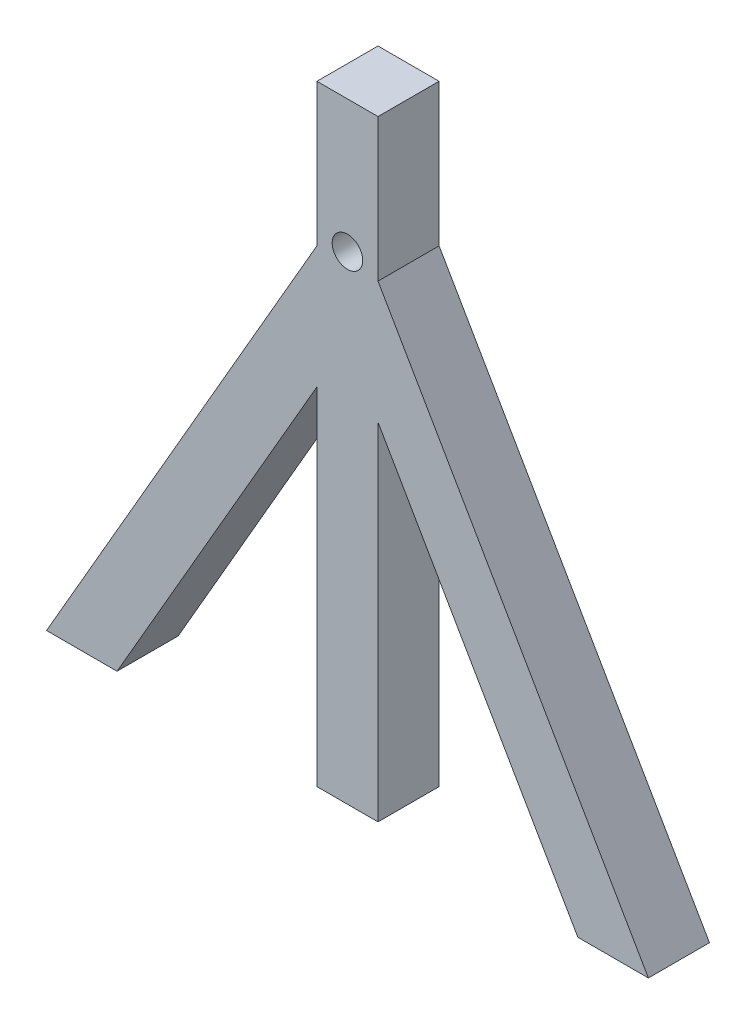
ISO-10303-21;
HEADER;
FILE_DESCRIPTION(('STEP AP214'),'2;1');
FILE_NAME('part.step','',(''),(''),'','','');
FILE_SCHEMA(('AUTOMOTIVE_DESIGN { 1 0 10303 214 1 1 1 1 }'));
ENDSEC;
DATA;
#1=APPLICATION_CONTEXT('core data for automotive mechanical design processes');
#2=APPLICATION_PROTOCOL_DEFINITION('international standard','automotive_design',2000,#1);
#3=PRODUCT_CONTEXT('',#1,'mechanical');
#4=PRODUCT('Part','Part','',(#3));
#5=PRODUCT_RELATED_PRODUCT_CATEGORY('part','',(#4));
#6=PRODUCT_DEFINITION_FORMATION('','',#4);
#7=PRODUCT_DEFINITION_CONTEXT('part definition',#1,'design');
#8=PRODUCT_DEFINITION('design','',#6,#7);
#9=PRODUCT_DEFINITION_SHAPE('','',#8);
#10=(LENGTH_UNIT() NAMED_UNIT(*) SI_UNIT(.MILLI.,.METRE.));
#11=(NAMED_UNIT(*) PLANE_ANGLE_UNIT() SI_UNIT($,.RADIAN.));
#12=(NAMED_UNIT(*) SI_UNIT($,.STERADIAN.) SOLID_ANGLE_UNIT());
#13=UNCERTAINTY_MEASURE_WITH_UNIT(LENGTH_MEASURE(1.E-05),#10,'distance_accuracy_value','');
#14=(GEOMETRIC_REPRESENTATION_CONTEXT(3) GLOBAL_UNCERTAINTY_ASSIGNED_CONTEXT((#13)) GLOBAL_UNIT_ASSIGNED_CONTEXT((#10,
#11,#12)) REPRESENTATION_CONTEXT('',''));
#15=CARTESIAN_POINT('',(0.,0.,0.));
#16=DIRECTION('',(0.,0.,1.));
#17=DIRECTION('',(1.,0.,0.));
#18=AXIS2_PLACEMENT_3D('',#15,#16,#17);
#19=CARTESIAN_POINT('',(14.9999999999999,80.0000000000009,30.));
#20=DIRECTION('',(-1.,0.,0.));
#21=DIRECTION('',(0.,-1.,0.));
#22=AXIS2_PLACEMENT_3D('',#19,#20,#21);
#23=PLANE('',#22);
#24=DIRECTION('',(0.,1.,0.));
#25=VECTOR('',#24,1.);
#26=CARTESIAN_POINT('',(14.9999999999999,80.0000000000009,0.));
#27=LINE('',#26,#25);
#28=CARTESIAN_POINT('',(14.9999999999999,80.0000000000009,0.));
#29=VERTEX_POINT('',#28);
#30=CARTESIAN_POINT('',(15.,150.,0.));
#31=VERTEX_POINT('',#30);
#32=EDGE_CURVE('E152',#29,#31,#27,.T.);
#33=ORIENTED_EDGE('',*,*,#32,.T.);
#34=DIRECTION('',(0.,0.,-1.));
#35=VECTOR('',#34,1.);
#36=CARTESIAN_POINT('',(15.,150.,30.));
#37=LINE('',#36,#35);
#38=CARTESIAN_POINT('',(15.,150.,30.));
#39=VERTEX_POINT('',#38);
#40=EDGE_CURVE('E11',#39,#31,#37,.T.);
#41=ORIENTED_EDGE('',*,*,#40,.F.);
#42=DIRECTION('',(0.,1.,0.));
#43=VECTOR('',#42,1.);
#44=CARTESIAN_POINT('',(14.9999999999999,80.0000000000009,30.));
#45=LINE('',#44,#43);
#46=CARTESIAN_POINT('',(14.9999999999999,80.0000000000009,30.));
#47=VERTEX_POINT('',#46);
#48=EDGE_CURVE('E175',#47,#39,#45,.T.);
#49=ORIENTED_EDGE('',*,*,#48,.F.);
#50=DIRECTION('',(0.,0.,-1.));
#51=VECTOR('',#50,1.);
#52=CARTESIAN_POINT('',(14.9999999999999,80.0000000000009,30.));
#53=LINE('',#52,#51);
#54=EDGE_CURVE('E148',#47,#29,#53,.T.);
#55=ORIENTED_EDGE('',*,*,#54,.T.);
#56=EDGE_LOOP('',(#33,#41,#49,#55));
#57=FACE_BOUND('',#56,.T.);
#58=ADVANCED_FACE('F32',(#57),#23,.F.);
#59=CARTESIAN_POINT('',(-15.,150.,30.));
#60=DIRECTION('',(0.,-1.,0.));
#61=DIRECTION('',(0.,0.,-1.));
#62=AXIS2_PLACEMENT_3D('',#59,#60,#61);
#63=PLANE('',#62);
#64=DIRECTION('',(-1.,0.,0.));
#65=VECTOR('',#64,1.);
#66=CARTESIAN_POINT('',(-15.,150.,0.));
#67=LINE('',#66,#65);
#68=CARTESIAN_POINT('',(-15.,150.,0.));
#69=VERTEX_POINT('',#68);
#70=EDGE_CURVE('E155',#31,#69,#67,.T.);
#71=ORIENTED_EDGE('',*,*,#70,.T.);
#72=DIRECTION('',(0.,0.,-1.));
#73=VECTOR('',#72,1.);
#74=CARTESIAN_POINT('',(-15.,150.,30.));
#75=LINE('',#74,#73);
#76=CARTESIAN_POINT('',(-15.,150.,30.));
#77=VERTEX_POINT('',#76);
#78=EDGE_CURVE('E40',#77,#69,#75,.T.);
#79=ORIENTED_EDGE('',*,*,#78,.F.);
#80=DIRECTION('',(-1.,0.,0.));
#81=VECTOR('',#80,1.);
#82=CARTESIAN_POINT('',(-15.,150.,30.));
#83=LINE('',#82,#81);
#84=EDGE_CURVE('E103',#39,#77,#83,.T.);
#85=ORIENTED_EDGE('',*,*,#84,.F.);
#86=ORIENTED_EDGE('',*,*,#40,.T.);
#87=EDGE_LOOP('',(#71,#79,#85,#86));
#88=FACE_BOUND('',#87,.T.);
#89=ADVANCED_FACE('F254',(#88),#63,.F.);
#90=CARTESIAN_POINT('',(-15.,80.0000000000009,30.));
#91=DIRECTION('',(1.,0.,0.));
#92=DIRECTION('',(0.,1.,0.));
#93=AXIS2_PLACEMENT_3D('',#90,#91,#92);
#94=PLANE('',#93);
#95=DIRECTION('',(0.,-1.,0.));
#96=VECTOR('',#95,1.);
#97=CARTESIAN_POINT('',(-15.,80.0000000000009,0.));
#98=LINE('',#97,#96);
#99=CARTESIAN_POINT('',(-15.,80.0000000000009,0.));
#100=VERTEX_POINT('',#99);
#101=EDGE_CURVE('E158',#69,#100,#98,.T.);
#102=ORIENTED_EDGE('',*,*,#101,.T.);
#103=DIRECTION('',(0.,0.,-1.));
#104=VECTOR('',#103,1.);
#105=CARTESIAN_POINT('',(-15.,80.0000000000009,30.));
#106=LINE('',#105,#104);
#107=CARTESIAN_POINT('',(-15.,80.0000000000009,30.));
#108=VERTEX_POINT('',#107);
#109=EDGE_CURVE('E194',#108,#100,#106,.T.);
#110=ORIENTED_EDGE('',*,*,#109,.F.);
#111=DIRECTION('',(0.,-1.,0.));
#112=VECTOR('',#111,1.);
#113=CARTESIAN_POINT('',(-15.,80.0000000000009,30.));
#114=LINE('',#113,#112);
#115=EDGE_CURVE('E202',#77,#108,#114,.T.);
#116=ORIENTED_EDGE('',*,*,#115,.F.);
#117=ORIENTED_EDGE('',*,*,#78,.T.);
#118=EDGE_LOOP('',(#102,#110,#116,#117));
#119=FACE_BOUND('',#118,.T.);
#120=ADVANCED_FACE('F200',(#119),#94,.F.);
#121=CARTESIAN_POINT('',(-147.790561913612,-150.,30.));
#122=DIRECTION('',(0.866025403784442,-0.499999999999995,0.));
#123=DIRECTION('',(0.499999999999995,0.866025403784442,0.));
#124=AXIS2_PLACEMENT_3D('',#121,#122,#123);
#125=PLANE('',#124);
#126=DIRECTION('',(-0.499999999999995,-0.866025403784442,0.));
#127=VECTOR('',#126,1.);
#128=CARTESIAN_POINT('',(-147.790561913612,-150.,0.));
#129=LINE('',#128,#127);
#130=CARTESIAN_POINT('',(-147.790561913612,-150.,0.));
#131=VERTEX_POINT('',#130);
#132=EDGE_CURVE('E160',#100,#131,#129,.T.);
#133=ORIENTED_EDGE('',*,*,#132,.T.);
#134=DIRECTION('',(0.,0.,-1.));
#135=VECTOR('',#134,1.);
#136=CARTESIAN_POINT('',(-147.790561913612,-150.,30.));
#137=LINE('',#136,#135);
#138=CARTESIAN_POINT('',(-147.790561913612,-150.,30.));
#139=VERTEX_POINT('',#138);
#140=EDGE_CURVE('E191',#139,#131,#137,.T.);
#141=ORIENTED_EDGE('',*,*,#140,.F.);
#142=DIRECTION('',(-0.499999999999995,-0.866025403784442,0.));
#143=VECTOR('',#142,1.);
#144=CARTESIAN_POINT('',(-147.790561913612,-150.,30.));
#145=LINE('',#144,#143);
#146=EDGE_CURVE('E220',#108,#139,#145,.T.);
#147=ORIENTED_EDGE('',*,*,#146,.F.);
#148=ORIENTED_EDGE('',*,*,#109,.T.);
#149=EDGE_LOOP('',(#133,#141,#147,#148));
#150=FACE_BOUND('',#149,.T.);
#151=ADVANCED_FACE('F211',(#150),#125,.F.);
#152=CARTESIAN_POINT('',(-113.149545762235,-150.,30.));
#153=DIRECTION('',(0.,1.,0.));
#154=DIRECTION('',(0.,0.,1.));
#155=AXIS2_PLACEMENT_3D('',#152,#153,#154);
#156=PLANE('',#155);
#157=DIRECTION('',(1.,0.,0.));
#158=VECTOR('',#157,1.);
#159=CARTESIAN_POINT('',(-113.149545762235,-150.,0.));
#160=LINE('',#159,#158);
#161=CARTESIAN_POINT('',(-113.149545762235,-150.,0.));
#162=VERTEX_POINT('',#161);
#163=EDGE_CURVE('E162',#131,#162,#160,.T.);
#164=ORIENTED_EDGE('',*,*,#163,.T.);
#165=DIRECTION('',(0.,0.,-1.));
#166=VECTOR('',#165,1.);
#167=CARTESIAN_POINT('',(-113.149545762235,-150.,30.));
#168=LINE('',#167,#166);
#169=CARTESIAN_POINT('',(-113.149545762235,-150.,30.));
#170=VERTEX_POINT('',#169);
#171=EDGE_CURVE('E188',#170,#162,#168,.T.);
#172=ORIENTED_EDGE('',*,*,#171,.F.);
#173=DIRECTION('',(1.,0.,0.));
#174=VECTOR('',#173,1.);
#175=CARTESIAN_POINT('',(-113.149545762235,-150.,30.));
#176=LINE('',#175,#174);
#177=EDGE_CURVE('E217',#139,#170,#176,.T.);
#178=ORIENTED_EDGE('',*,*,#177,.F.);
#179=ORIENTED_EDGE('',*,*,#140,.T.);
#180=EDGE_LOOP('',(#164,#172,#178,#179));
#181=FACE_BOUND('',#180,.T.);
#182=ADVANCED_FACE('F215',(#181),#156,.F.);
#183=CARTESIAN_POINT('',(-15.,20.0000000000002,30.));
#184=DIRECTION('',(-0.866025403784442,0.499999999999995,0.));
#185=DIRECTION('',(-0.499999999999995,-0.866025403784442,0.));
#186=AXIS2_PLACEMENT_3D('',#183,#184,#185);
#187=PLANE('',#186);
#188=DIRECTION('',(0.499999999999995,0.866025403784442,0.));
#189=VECTOR('',#188,1.);
#190=CARTESIAN_POINT('',(-15.,20.0000000000002,0.));
#191=LINE('',#190,#189);
#192=CARTESIAN_POINT('',(-15.,20.0000000000002,0.));
#193=VERTEX_POINT('',#192);
#194=EDGE_CURVE('E164',#162,#193,#191,.T.);
#195=ORIENTED_EDGE('',*,*,#194,.T.);
#196=DIRECTION('',(0.,0.,-1.));
#197=VECTOR('',#196,1.);
#198=CARTESIAN_POINT('',(-15.,20.0000000000002,30.));
#199=LINE('',#198,#197);
#200=CARTESIAN_POINT('',(-15.,20.0000000000002,30.));
#201=VERTEX_POINT('',#200);
#202=EDGE_CURVE('E185',#201,#193,#199,.T.);
#203=ORIENTED_EDGE('',*,*,#202,.F.);
#204=DIRECTION('',(0.499999999999995,0.866025403784442,0.));
#205=VECTOR('',#204,1.);
#206=CARTESIAN_POINT('',(-15.,20.0000000000002,30.));
#207=LINE('',#206,#205);
#208=EDGE_CURVE('E219',#170,#201,#207,.T.);
#209=ORIENTED_EDGE('',*,*,#208,.F.);
#210=ORIENTED_EDGE('',*,*,#171,.T.);
#211=EDGE_LOOP('',(#195,#203,#209,#210));
#212=FACE_BOUND('',#211,.T.);
#213=ADVANCED_FACE('F267',(#212),#187,.F.);
#214=CARTESIAN_POINT('',(-15.,-150.,30.));
#215=DIRECTION('',(1.,0.,0.));
#216=DIRECTION('',(0.,1.,0.));
#217=AXIS2_PLACEMENT_3D('',#214,#215,#216);
#218=PLANE('',#217);
#219=DIRECTION('',(0.,-1.,0.));
#220=VECTOR('',#219,1.);
#221=CARTESIAN_POINT('',(-15.,-150.,0.));
#222=LINE('',#221,#220);
#223=CARTESIAN_POINT('',(-15.,-150.,0.));
#224=VERTEX_POINT('',#223);
#225=EDGE_CURVE('E166',#193,#224,#222,.T.);
#226=ORIENTED_EDGE('',*,*,#225,.T.);
#227=DIRECTION('',(0.,0.,-1.));
#228=VECTOR('',#227,1.);
#229=CARTESIAN_POINT('',(-15.,-150.,30.));
#230=LINE('',#229,#228);
#231=CARTESIAN_POINT('',(-15.,-150.,30.));
#232=VERTEX_POINT('',#231);
#233=EDGE_CURVE('E182',#232,#224,#230,.T.);
#234=ORIENTED_EDGE('',*,*,#233,.F.);
#235=DIRECTION('',(0.,-1.,0.));
#236=VECTOR('',#235,1.);
#237=CARTESIAN_POINT('',(-15.,-150.,30.));
#238=LINE('',#237,#236);
#239=EDGE_CURVE('E222',#201,#232,#238,.T.);
#240=ORIENTED_EDGE('',*,*,#239,.F.);
#241=ORIENTED_EDGE('',*,*,#202,.T.);
#242=EDGE_LOOP('',(#226,#234,#240,#241));
#243=FACE_BOUND('',#242,.T.);
#244=ADVANCED_FACE('F270',(#243),#218,.F.);
#245=CARTESIAN_POINT('',(-15.,-150.,30.));
#246=DIRECTION('',(0.,1.,0.));
#247=DIRECTION('',(0.,0.,1.));
#248=AXIS2_PLACEMENT_3D('',#245,#246,#247);
#249=PLANE('',#248);
#250=DIRECTION('',(1.,0.,0.));
#251=VECTOR('',#250,1.);
#252=CARTESIAN_POINT('',(-15.,-150.,0.));
#253=LINE('',#252,#251);
#254=CARTESIAN_POINT('',(15.,-150.,0.));
#255=VERTEX_POINT('',#254);
#256=EDGE_CURVE('E168',#224,#255,#253,.T.);
#257=ORIENTED_EDGE('',*,*,#256,.T.);
#258=DIRECTION('',(0.,0.,-1.));
#259=VECTOR('',#258,1.);
#260=CARTESIAN_POINT('',(15.,-150.,30.));
#261=LINE('',#260,#259);
#262=CARTESIAN_POINT('',(15.,-150.,30.));
#263=VERTEX_POINT('',#262);
#264=EDGE_CURVE('E179',#263,#255,#261,.T.);
#265=ORIENTED_EDGE('',*,*,#264,.F.);
#266=DIRECTION('',(1.,0.,0.));
#267=VECTOR('',#266,1.);
#268=CARTESIAN_POINT('',(-15.,-150.,30.));
#269=LINE('',#268,#267);
#270=EDGE_CURVE('E228',#232,#263,#269,.T.);
#271=ORIENTED_EDGE('',*,*,#270,.F.);
#272=ORIENTED_EDGE('',*,*,#233,.T.);
#273=EDGE_LOOP('',(#257,#265,#271,#272));
#274=FACE_BOUND('',#273,.T.);
#275=ADVANCED_FACE('F234',(#274),#249,.F.);
#276=CARTESIAN_POINT('',(15.,-150.,30.));
#277=DIRECTION('',(-1.,0.,0.));
#278=DIRECTION('',(0.,-1.,0.));
#279=AXIS2_PLACEMENT_3D('',#276,#277,#278);
#280=PLANE('',#279);
#281=DIRECTION('',(0.,1.,0.));
#282=VECTOR('',#281,1.);
#283=CARTESIAN_POINT('',(15.,-150.,0.));
#284=LINE('',#283,#282);
#285=CARTESIAN_POINT('',(15.,20.0000000000002,0.));
#286=VERTEX_POINT('',#285);
#287=EDGE_CURVE('E170',#255,#286,#284,.T.);
#288=ORIENTED_EDGE('',*,*,#287,.T.);
#289=DIRECTION('',(0.,0.,-1.));
#290=VECTOR('',#289,1.);
#291=CARTESIAN_POINT('',(15.,20.0000000000002,30.));
#292=LINE('',#291,#290);
#293=CARTESIAN_POINT('',(15.,20.0000000000002,30.));
#294=VERTEX_POINT('',#293);
#295=EDGE_CURVE('E143',#294,#286,#292,.T.);
#296=ORIENTED_EDGE('',*,*,#295,.F.);
#297=DIRECTION('',(0.,1.,0.));
#298=VECTOR('',#297,1.);
#299=CARTESIAN_POINT('',(15.,-150.,30.));
#300=LINE('',#299,#298);
#301=EDGE_CURVE('E134',#263,#294,#300,.T.);
#302=ORIENTED_EDGE('',*,*,#301,.F.);
#303=ORIENTED_EDGE('',*,*,#264,.T.);
#304=EDGE_LOOP('',(#288,#296,#302,#303));
#305=FACE_BOUND('',#304,.T.);
#306=ADVANCED_FACE('F238',(#305),#280,.F.);
#307=CARTESIAN_POINT('',(15.,20.0000000000002,30.));
#308=DIRECTION('',(0.866025403784442,0.499999999999995,0.));
#309=DIRECTION('',(-0.499999999999995,0.866025403784442,0.));
#310=AXIS2_PLACEMENT_3D('',#307,#308,#309);
#311=PLANE('',#310);
#312=DIRECTION('',(0.499999999999995,-0.866025403784442,0.));
#313=VECTOR('',#312,1.);
#314=CARTESIAN_POINT('',(15.,20.0000000000002,0.));
#315=LINE('',#314,#313);
#316=CARTESIAN_POINT('',(113.149545762235,-150.,0.));
#317=VERTEX_POINT('',#316);
#318=EDGE_CURVE('E142',#286,#317,#315,.T.);
#319=ORIENTED_EDGE('',*,*,#318,.T.);
#320=DIRECTION('',(0.,0.,-1.));
#321=VECTOR('',#320,1.);
#322=CARTESIAN_POINT('',(113.149545762235,-150.,30.));
#323=LINE('',#322,#321);
#324=CARTESIAN_POINT('',(113.149545762235,-150.,30.));
#325=VERTEX_POINT('',#324);
#326=EDGE_CURVE('E139',#325,#317,#323,.T.);
#327=ORIENTED_EDGE('',*,*,#326,.F.);
#328=DIRECTION('',(0.499999999999995,-0.866025403784442,0.));
#329=VECTOR('',#328,1.);
#330=CARTESIAN_POINT('',(15.,20.0000000000002,30.));
#331=LINE('',#330,#329);
#332=EDGE_CURVE('E128',#294,#325,#331,.T.);
#333=ORIENTED_EDGE('',*,*,#332,.F.);
#334=ORIENTED_EDGE('',*,*,#295,.T.);
#335=EDGE_LOOP('',(#319,#327,#333,#334));
#336=FACE_BOUND('',#335,.T.);
#337=ADVANCED_FACE('F140',(#336),#311,.F.);
#338=CARTESIAN_POINT('',(113.149545762235,-150.,30.));
#339=DIRECTION('',(0.,1.,0.));
#340=DIRECTION('',(0.,0.,1.));
#341=AXIS2_PLACEMENT_3D('',#338,#339,#340);
#342=PLANE('',#341);
#343=DIRECTION('',(1.,0.,0.));
#344=VECTOR('',#343,1.);
#345=CARTESIAN_POINT('',(113.149545762235,-150.,0.));
#346=LINE('',#345,#344);
#347=CARTESIAN_POINT('',(147.790561913612,-150.,0.));
#348=VERTEX_POINT('',#347);
#349=EDGE_CURVE('E89',#317,#348,#346,.T.);
#350=ORIENTED_EDGE('',*,*,#349,.T.);
#351=DIRECTION('',(0.,0.,-1.));
#352=VECTOR('',#351,1.);
#353=CARTESIAN_POINT('',(147.790561913612,-150.,30.));
#354=LINE('',#353,#352);
#355=CARTESIAN_POINT('',(147.790561913612,-150.,30.));
#356=VERTEX_POINT('',#355);
#357=EDGE_CURVE('E144',#356,#348,#354,.T.);
#358=ORIENTED_EDGE('',*,*,#357,.F.);
#359=DIRECTION('',(1.,0.,0.));
#360=VECTOR('',#359,1.);
#361=CARTESIAN_POINT('',(113.149545762235,-150.,30.));
#362=LINE('',#361,#360);
#363=EDGE_CURVE('E132',#325,#356,#362,.T.);
#364=ORIENTED_EDGE('',*,*,#363,.F.);
#365=ORIENTED_EDGE('',*,*,#326,.T.);
#366=EDGE_LOOP('',(#350,#358,#364,#365));
#367=FACE_BOUND('',#366,.T.);
#368=ADVANCED_FACE('F146',(#367),#342,.F.);
#369=CARTESIAN_POINT('',(147.790561913612,-150.,30.));
#370=DIRECTION('',(-0.866025403784441,-0.499999999999995,0.));
#371=DIRECTION('',(0.499999999999995,-0.866025403784442,0.));
#372=AXIS2_PLACEMENT_3D('',#369,#370,#371);
#373=PLANE('',#372);
#374=DIRECTION('',(-0.499999999999995,0.866025403784442,0.));
#375=VECTOR('',#374,1.);
#376=CARTESIAN_POINT('',(147.790561913612,-150.,0.));
#377=LINE('',#376,#375);
#378=EDGE_CURVE('E95',#348,#29,#377,.T.);
#379=ORIENTED_EDGE('',*,*,#378,.T.);
#380=ORIENTED_EDGE('',*,*,#54,.F.);
#381=DIRECTION('',(-0.499999999999995,0.866025403784442,0.));
#382=VECTOR('',#381,1.);
#383=CARTESIAN_POINT('',(147.790561913612,-150.,30.));
#384=LINE('',#383,#382);
#385=EDGE_CURVE('E48',#356,#47,#384,.T.);
#386=ORIENTED_EDGE('',*,*,#385,.F.);
#387=ORIENTED_EDGE('',*,*,#357,.T.);
#388=EDGE_LOOP('',(#379,#380,#386,#387));
#389=FACE_BOUND('',#388,.T.);
#390=ADVANCED_FACE('F242',(#389),#373,.F.);
#391=CARTESIAN_POINT('',(0.,0.,30.));
#392=DIRECTION('',(0.,0.,-1.));
#393=DIRECTION('',(-1.,0.,0.));
#394=AXIS2_PLACEMENT_3D('',#391,#392,#393);
#395=PLANE('',#394);
#396=CARTESIAN_POINT('',(0.,85.0000000000001,30.));
#397=DIRECTION('',(0.,0.,1.));
#398=DIRECTION('',(1.,0.,0.));
#399=AXIS2_PLACEMENT_3D('',#396,#397,#398);
#400=CIRCLE('',#399,7.5);
#401=CARTESIAN_POINT('',(7.5,85.0000000000001,30.));
#402=VERTEX_POINT('',#401);
#403=EDGE_CURVE('E325',#402,#402,#400,.T.);
#404=ORIENTED_EDGE('',*,*,#403,.F.);
#405=EDGE_LOOP('',(#404));
#406=FACE_BOUND('',#405,.T.);
#407=ORIENTED_EDGE('',*,*,#48,.T.);
#408=ORIENTED_EDGE('',*,*,#84,.T.);
#409=ORIENTED_EDGE('',*,*,#115,.T.);
#410=ORIENTED_EDGE('',*,*,#146,.T.);
#411=ORIENTED_EDGE('',*,*,#177,.T.);
#412=ORIENTED_EDGE('',*,*,#208,.T.);
#413=ORIENTED_EDGE('',*,*,#239,.T.);
#414=ORIENTED_EDGE('',*,*,#270,.T.);
#415=ORIENTED_EDGE('',*,*,#301,.T.);
#416=ORIENTED_EDGE('',*,*,#332,.T.);
#417=ORIENTED_EDGE('',*,*,#363,.T.);
#418=ORIENTED_EDGE('',*,*,#385,.T.);
#419=EDGE_LOOP('',(#407,#408,#409,#410,#411,#412,#413,#414,#415,#416,#417,#418));
#420=FACE_BOUND('',#419,.T.);
#421=ADVANCED_FACE('F130',(#406,#420),#395,.F.);
#422=CARTESIAN_POINT('',(0.,0.,0.));
#423=DIRECTION('',(0.,0.,-1.));
#424=DIRECTION('',(-1.,0.,0.));
#425=AXIS2_PLACEMENT_3D('',#422,#423,#424);
#426=PLANE('',#425);
#427=CARTESIAN_POINT('',(0.,85.0000000000001,0.));
#428=DIRECTION('',(0.,0.,1.));
#429=DIRECTION('',(1.,0.,0.));
#430=AXIS2_PLACEMENT_3D('',#427,#428,#429);
#431=CIRCLE('',#430,7.5);
#432=CARTESIAN_POINT('',(7.5,85.0000000000001,0.));
#433=VERTEX_POINT('',#432);
#434=EDGE_CURVE('E156',#433,#433,#431,.T.);
#435=ORIENTED_EDGE('',*,*,#434,.T.);
#436=EDGE_LOOP('',(#435));
#437=FACE_BOUND('',#436,.T.);
#438=ORIENTED_EDGE('',*,*,#32,.F.);
#439=ORIENTED_EDGE('',*,*,#378,.F.);
#440=ORIENTED_EDGE('',*,*,#349,.F.);
#441=ORIENTED_EDGE('',*,*,#318,.F.);
#442=ORIENTED_EDGE('',*,*,#287,.F.);
#443=ORIENTED_EDGE('',*,*,#256,.F.);
#444=ORIENTED_EDGE('',*,*,#225,.F.);
#445=ORIENTED_EDGE('',*,*,#194,.F.);
#446=ORIENTED_EDGE('',*,*,#163,.F.);
#447=ORIENTED_EDGE('',*,*,#132,.F.);
#448=ORIENTED_EDGE('',*,*,#101,.F.);
#449=ORIENTED_EDGE('',*,*,#70,.F.);
#450=EDGE_LOOP('',(#438,#439,#440,#441,#442,#443,#444,#445,#446,#447,#448,#449));
#451=FACE_BOUND('',#450,.T.);
#452=ADVANCED_FACE('F206',(#437,#451),#426,.T.);
#453=CARTESIAN_POINT('',(0.,85.0000000000001,0.));
#454=DIRECTION('',(0.,0.,1.));
#455=DIRECTION('',(1.,0.,0.));
#456=AXIS2_PLACEMENT_3D('',#453,#454,#455);
#457=CYLINDRICAL_SURFACE('',#456,7.5);
#458=ORIENTED_EDGE('',*,*,#434,.F.);
#459=EDGE_LOOP('',(#458));
#460=FACE_BOUND('',#459,.T.);
#461=ORIENTED_EDGE('',*,*,#403,.T.);
#462=EDGE_LOOP('',(#461));
#463=FACE_BOUND('',#462,.T.);
#464=ADVANCED_FACE('F307',(#460,#463),#457,.F.);
#465=CLOSED_SHELL('',(#58,#89,#120,#151,#182,#213,#244,#275,#306,#337,#368,#390,#421,#452,#464));
#466=MANIFOLD_SOLID_BREP('B2',#465);
#467=ADVANCED_BREP_SHAPE_REPRESENTATION('',(#18,#466),#14);
#468=SHAPE_DEFINITION_REPRESENTATION(#9,#467);
ENDSEC;
END-ISO-10303-21;
